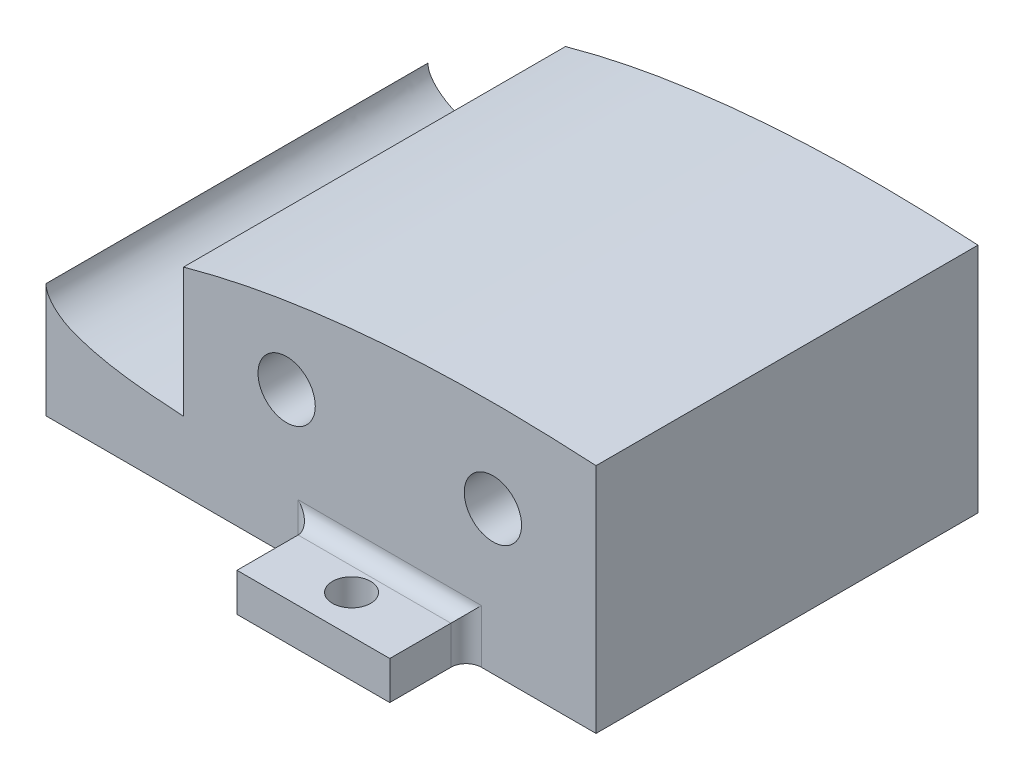
ISO-10303-21;
HEADER;
FILE_DESCRIPTION(('STEP AP214'),'2;1');
FILE_NAME('part.step','',(''),(''),'','','');
FILE_SCHEMA(('AUTOMOTIVE_DESIGN { 1 0 10303 214 1 1 1 1 }'));
ENDSEC;
DATA;
#1=APPLICATION_CONTEXT('core data for automotive mechanical design processes');
#2=APPLICATION_PROTOCOL_DEFINITION('international standard','automotive_design',2000,#1);
#3=PRODUCT_CONTEXT('',#1,'mechanical');
#4=PRODUCT('Part','Part','',(#3));
#5=PRODUCT_RELATED_PRODUCT_CATEGORY('part','',(#4));
#6=PRODUCT_DEFINITION_FORMATION('','',#4);
#7=PRODUCT_DEFINITION_CONTEXT('part definition',#1,'design');
#8=PRODUCT_DEFINITION('design','',#6,#7);
#9=PRODUCT_DEFINITION_SHAPE('','',#8);
#10=(LENGTH_UNIT() NAMED_UNIT(*) SI_UNIT(.MILLI.,.METRE.));
#11=(NAMED_UNIT(*) PLANE_ANGLE_UNIT() SI_UNIT($,.RADIAN.));
#12=(NAMED_UNIT(*) SI_UNIT($,.STERADIAN.) SOLID_ANGLE_UNIT());
#13=UNCERTAINTY_MEASURE_WITH_UNIT(LENGTH_MEASURE(1.E-05),#10,'distance_accuracy_value','');
#14=(GEOMETRIC_REPRESENTATION_CONTEXT(3) GLOBAL_UNCERTAINTY_ASSIGNED_CONTEXT((#13)) GLOBAL_UNIT_ASSIGNED_CONTEXT((#10,
#11,#12)) REPRESENTATION_CONTEXT('',''));
#15=CARTESIAN_POINT('',(0.,0.,0.));
#16=DIRECTION('',(0.,0.,1.));
#17=DIRECTION('',(1.,0.,0.));
#18=AXIS2_PLACEMENT_3D('',#15,#16,#17);
#19=CARTESIAN_POINT('',(10.2056970357556,-6.31582471231669,31.75));
#20=DIRECTION('',(0.,0.,-1.));
#21=DIRECTION('',(-1.,0.,0.));
#22=AXIS2_PLACEMENT_3D('',#19,#20,#21);
#23=PLANE('',#22);
#24=CARTESIAN_POINT('',(40.005,4.73459418824922,31.75));
#25=DIRECTION('',(0.,0.,1.));
#26=DIRECTION('',(1.,0.,0.));
#27=AXIS2_PLACEMENT_3D('',#24,#25,#26);
#28=CIRCLE('',#27,4.7625);
#29=CARTESIAN_POINT('',(44.7675,4.73459418824922,31.75));
#30=VERTEX_POINT('',#29);
#31=EDGE_CURVE('E234',#30,#30,#28,.T.);
#32=ORIENTED_EDGE('',*,*,#31,.F.);
#33=EDGE_LOOP('',(#32));
#34=FACE_BOUND('',#33,.T.);
#35=CARTESIAN_POINT('',(74.295,4.73459418824922,31.75));
#36=DIRECTION('',(0.,0.,1.));
#37=DIRECTION('',(1.,0.,0.));
#38=AXIS2_PLACEMENT_3D('',#35,#36,#37);
#39=CIRCLE('',#38,4.7625);
#40=CARTESIAN_POINT('',(79.0575,4.73459418824922,31.75));
#41=VERTEX_POINT('',#40);
#42=EDGE_CURVE('E239',#41,#41,#39,.T.);
#43=ORIENTED_EDGE('',*,*,#42,.F.);
#44=EDGE_LOOP('',(#43));
#45=FACE_BOUND('',#44,.T.);
#46=DIRECTION('',(1.,0.,0.));
#47=VECTOR('',#46,1.);
#48=CARTESIAN_POINT('',(10.2056970357556,-10.16,31.75));
#49=LINE('',#48,#47);
#50=CARTESIAN_POINT('',(41.91,-10.16,31.75));
#51=VERTEX_POINT('',#50);
#52=CARTESIAN_POINT('',(72.39,-10.16,31.75));
#53=VERTEX_POINT('',#52);
#54=EDGE_CURVE('E395',#51,#53,#49,.T.);
#55=ORIENTED_EDGE('',*,*,#54,.T.);
#56=DIRECTION('',(0.,-1.,0.));
#57=VECTOR('',#56,1.);
#58=CARTESIAN_POINT('',(72.39,-6.31582471231669,31.75));
#59=LINE('',#58,#57);
#60=CARTESIAN_POINT('',(72.39,-19.05,31.75));
#61=VERTEX_POINT('',#60);
#62=EDGE_CURVE('E397',#53,#61,#59,.T.);
#63=ORIENTED_EDGE('',*,*,#62,.T.);
#64=DIRECTION('',(1.,0.,0.));
#65=VECTOR('',#64,1.);
#66=CARTESIAN_POINT('',(0.,-19.05,31.75));
#67=LINE('',#66,#65);
#68=CARTESIAN_POINT('',(91.44,-19.05,31.75));
#69=VERTEX_POINT('',#68);
#70=EDGE_CURVE('E253',#61,#69,#67,.T.);
#71=ORIENTED_EDGE('',*,*,#70,.T.);
#72=DIRECTION('',(0.,1.,0.));
#73=VECTOR('',#72,1.);
#74=CARTESIAN_POINT('',(91.44,-19.05,31.75));
#75=LINE('',#74,#73);
#76=CARTESIAN_POINT('',(91.44,19.5088736891979,31.75));
#77=VERTEX_POINT('',#76);
#78=EDGE_CURVE('E257',#69,#77,#75,.T.);
#79=ORIENTED_EDGE('',*,*,#78,.T.);
#80=CARTESIAN_POINT('',(91.44,19.5088736891978,31.75));
#81=CARTESIAN_POINT('',(84.0356208057941,19.9340562675606,31.75));
#82=CARTESIAN_POINT('',(72.7920173753231,20.2231971549313,31.75));
#83=CARTESIAN_POINT('',(57.7264010197968,19.5765861767158,31.75));
#84=CARTESIAN_POINT('',(46.2411379939035,18.4871941623707,31.75));
#85=CARTESIAN_POINT('',(34.713862172181,16.7389871339913,31.75));
#86=CARTESIAN_POINT('',(26.9507844864313,14.9427772095461,31.75));
#87=CARTESIAN_POINT('',(23.0064368505171,13.8506529487284,31.75));
#88=CARTESIAN_POINT('',(22.86,13.8098436201286,31.75));
#89=B_SPLINE_CURVE_WITH_KNOTS('',3,(#80,#81,#82,#83,#84,#85,#86,#87,#88),.UNSPECIFIED.,.F.,.F.,
(4,1,1,1,1,1,4),(0.299041320860091,0.346600594361287,0.371102737044853,0.395726297170324,
0.420570145356384,0.445825119255769,0.446799337210652),.UNSPECIFIED.);
#90=CARTESIAN_POINT('',(22.86,13.8098436201286,31.75));
#91=VERTEX_POINT('',#90);
#92=EDGE_CURVE('E260',#77,#91,#89,.T.);
#93=ORIENTED_EDGE('',*,*,#92,.T.);
#94=DIRECTION('',(0.,-1.,0.));
#95=VECTOR('',#94,1.);
#96=CARTESIAN_POINT('',(22.86,-7.67430327285865,31.75));
#97=LINE('',#96,#95);
#98=CARTESIAN_POINT('',(22.86,-7.67430327285865,31.75));
#99=VERTEX_POINT('',#98);
#100=EDGE_CURVE('E265',#91,#99,#97,.T.);
#101=ORIENTED_EDGE('',*,*,#100,.T.);
#102=CARTESIAN_POINT('',(22.86,-7.67430327285865,31.75));
#103=CARTESIAN_POINT('',(22.8179718838394,-7.67196252222702,31.75));
#104=CARTESIAN_POINT('',(20.8708976464376,-7.56281406861255,31.75));
#105=CARTESIAN_POINT('',(17.0138961117884,-7.2812831021067,31.75));
#106=CARTESIAN_POINT('',(11.2894173856809,-6.62752917001449,31.75));
#107=CARTESIAN_POINT('',(6.45703018897089,-5.50998661950332,31.75));
#108=CARTESIAN_POINT('',(2.41602196168863,-3.93592215596752,31.75));
#109=CARTESIAN_POINT('',(0.134938935978925,-1.68844864889388,31.75));
#110=CARTESIAN_POINT('',(-2.62126690560269E-12,-0.178677160299536,31.75));
#111=CARTESIAN_POINT('',(0.,0.,31.75));
#112=B_SPLINE_CURVE_WITH_KNOTS('',3,(#102,#103,#104,#105,#106,#107,#108,#109,#110,#111),
.UNSPECIFIED.,.F.,.F.,(4,1,1,1,1,1,1,4),(0.505625692779016,0.505895616382474,0.518130853139829,
0.530412973038793,0.542915984505902,0.549534217048153,0.558818957921815,0.560056294318642),.UNSPECIFIED.);
#113=CARTESIAN_POINT('',(0.,0.,31.75));
#114=VERTEX_POINT('',#113);
#115=EDGE_CURVE('E242',#99,#114,#112,.T.);
#116=ORIENTED_EDGE('',*,*,#115,.T.);
#117=DIRECTION('',(0.,-1.,0.));
#118=VECTOR('',#117,1.);
#119=CARTESIAN_POINT('',(0.,0.,31.75));
#120=LINE('',#119,#118);
#121=CARTESIAN_POINT('',(0.,-19.05,31.75));
#122=VERTEX_POINT('',#121);
#123=EDGE_CURVE('E247',#114,#122,#120,.T.);
#124=ORIENTED_EDGE('',*,*,#123,.T.);
#125=CARTESIAN_POINT('',(41.91,-19.05,31.75));
#126=VERTEX_POINT('',#125);
#127=EDGE_CURVE('E254',#122,#126,#67,.T.);
#128=ORIENTED_EDGE('',*,*,#127,.T.);
#129=DIRECTION('',(0.,-1.,0.));
#130=VECTOR('',#129,1.);
#131=CARTESIAN_POINT('',(41.91,-6.31582471231669,31.75));
#132=LINE('',#131,#130);
#133=EDGE_CURVE('E393',#126,#51,#132,.F.);
#134=ORIENTED_EDGE('',*,*,#133,.T.);
#135=EDGE_LOOP('',(#55,#63,#71,#79,#93,#101,#116,#124,#128,#134));
#136=FACE_BOUND('',#135,.T.);
#137=ADVANCED_FACE('F39',(#34,#45,#136),#23,.F.);
#138=CARTESIAN_POINT('',(22.86,-7.67430327285865,-31.75));
#139=CARTESIAN_POINT('',(22.8179718838394,-7.67196252222702,-31.75));
#140=CARTESIAN_POINT('',(20.8708976464376,-7.56281406861255,-31.75));
#141=CARTESIAN_POINT('',(17.0138961117884,-7.2812831021067,-31.75));
#142=CARTESIAN_POINT('',(11.2894173856809,-6.62752917001449,-31.75));
#143=CARTESIAN_POINT('',(6.45703018897089,-5.50998661950332,-31.75));
#144=CARTESIAN_POINT('',(2.41602196168863,-3.93592215596752,-31.75));
#145=CARTESIAN_POINT('',(0.134938935978925,-1.68844864889388,-31.75));
#146=CARTESIAN_POINT('',(-2.62126690560269E-12,-0.178677160299536,-31.75));
#147=CARTESIAN_POINT('',(0.,0.,-31.75));
#148=B_SPLINE_CURVE_WITH_KNOTS('',3,(#138,#139,#140,#141,#142,#143,#144,#145,#146,#147),
.UNSPECIFIED.,.F.,.F.,(4,1,1,1,1,1,1,4),(0.505625692779016,0.505895616382474,0.518130853139829,
0.530412973038793,0.542915984505902,0.549534217048153,0.558818957921815,0.560056294318642),.UNSPECIFIED.);
#149=DIRECTION('',(0.,0.,1.));
#150=VECTOR('',#149,1.);
#151=SURFACE_OF_LINEAR_EXTRUSION('',#148,#150);
#152=DIRECTION('',(0.,0.,1.));
#153=VECTOR('',#152,1.);
#154=CARTESIAN_POINT('',(0.,0.,-31.75));
#155=LINE('',#154,#153);
#156=CARTESIAN_POINT('',(0.,0.,-31.75));
#157=VERTEX_POINT('',#156);
#158=EDGE_CURVE('E369',#157,#114,#155,.T.);
#159=ORIENTED_EDGE('',*,*,#158,.T.);
#160=ORIENTED_EDGE('',*,*,#115,.F.);
#161=DIRECTION('',(0.,0.,1.));
#162=VECTOR('',#161,1.);
#163=CARTESIAN_POINT('',(22.86,-7.67430327285865,-31.75));
#164=LINE('',#163,#162);
#165=CARTESIAN_POINT('',(22.86,-7.67430327285865,-31.75));
#166=VERTEX_POINT('',#165);
#167=EDGE_CURVE('E370',#166,#99,#164,.T.);
#168=ORIENTED_EDGE('',*,*,#167,.F.);
#169=EDGE_CURVE('E277',#166,#157,#148,.T.);
#170=ORIENTED_EDGE('',*,*,#169,.T.);
#171=EDGE_LOOP('',(#159,#160,#168,#170));
#172=FACE_BOUND('',#171,.T.);
#173=ADVANCED_FACE('F289',(#172),#151,.T.);
#174=CARTESIAN_POINT('',(22.86,-7.67430327285865,-31.75));
#175=DIRECTION('',(-1.,0.,0.));
#176=DIRECTION('',(0.,-1.,0.));
#177=AXIS2_PLACEMENT_3D('',#174,#175,#176);
#178=PLANE('',#177);
#179=ORIENTED_EDGE('',*,*,#167,.T.);
#180=ORIENTED_EDGE('',*,*,#100,.F.);
#181=DIRECTION('',(0.,0.,1.));
#182=VECTOR('',#181,1.);
#183=CARTESIAN_POINT('',(22.86,13.8098436201286,-31.75));
#184=LINE('',#183,#182);
#185=CARTESIAN_POINT('',(22.86,13.8098436201286,-31.75));
#186=VERTEX_POINT('',#185);
#187=EDGE_CURVE('E373',#186,#91,#184,.T.);
#188=ORIENTED_EDGE('',*,*,#187,.F.);
#189=DIRECTION('',(0.,-1.,0.));
#190=VECTOR('',#189,1.);
#191=CARTESIAN_POINT('',(22.86,-7.67430327285865,-31.75));
#192=LINE('',#191,#190);
#193=EDGE_CURVE('E362',#186,#166,#192,.T.);
#194=ORIENTED_EDGE('',*,*,#193,.T.);
#195=EDGE_LOOP('',(#179,#180,#188,#194));
#196=FACE_BOUND('',#195,.T.);
#197=ADVANCED_FACE('F293',(#196),#178,.T.);
#198=CARTESIAN_POINT('',(91.44,19.5088736891978,-31.75));
#199=CARTESIAN_POINT('',(84.0356208057941,19.9340562675606,-31.75));
#200=CARTESIAN_POINT('',(72.7920173753231,20.2231971549313,-31.75));
#201=CARTESIAN_POINT('',(57.7264010197968,19.5765861767158,-31.75));
#202=CARTESIAN_POINT('',(46.2411379939035,18.4871941623707,-31.75));
#203=CARTESIAN_POINT('',(34.713862172181,16.7389871339913,-31.75));
#204=CARTESIAN_POINT('',(26.9507844864313,14.9427772095461,-31.75));
#205=CARTESIAN_POINT('',(23.0064368505171,13.8506529487284,-31.75));
#206=CARTESIAN_POINT('',(22.86,13.8098436201286,-31.75));
#207=B_SPLINE_CURVE_WITH_KNOTS('',3,(#198,#199,#200,#201,#202,#203,#204,#205,#206),
.UNSPECIFIED.,.F.,.F.,(4,1,1,1,1,1,4),(0.299041320860091,0.346600594361287,0.371102737044853,
0.395726297170324,0.420570145356384,0.445825119255769,0.446799337210652),.UNSPECIFIED.);
#208=DIRECTION('',(0.,0.,1.));
#209=VECTOR('',#208,1.);
#210=SURFACE_OF_LINEAR_EXTRUSION('',#207,#209);
#211=ORIENTED_EDGE('',*,*,#187,.T.);
#212=ORIENTED_EDGE('',*,*,#92,.F.);
#213=DIRECTION('',(0.,0.,1.));
#214=VECTOR('',#213,1.);
#215=CARTESIAN_POINT('',(91.44,19.5088736891979,-31.75));
#216=LINE('',#215,#214);
#217=CARTESIAN_POINT('',(91.44,19.5088736891979,-31.75));
#218=VERTEX_POINT('',#217);
#219=EDGE_CURVE('E375',#218,#77,#216,.T.);
#220=ORIENTED_EDGE('',*,*,#219,.F.);
#221=EDGE_CURVE('E355',#218,#186,#207,.T.);
#222=ORIENTED_EDGE('',*,*,#221,.T.);
#223=EDGE_LOOP('',(#211,#212,#220,#222));
#224=FACE_BOUND('',#223,.T.);
#225=ADVANCED_FACE('F348',(#224),#210,.T.);
#226=CARTESIAN_POINT('',(91.44,-19.05,-31.75));
#227=DIRECTION('',(1.,0.,0.));
#228=DIRECTION('',(0.,1.,0.));
#229=AXIS2_PLACEMENT_3D('',#226,#227,#228);
#230=PLANE('',#229);
#231=ORIENTED_EDGE('',*,*,#219,.T.);
#232=ORIENTED_EDGE('',*,*,#78,.F.);
#233=DIRECTION('',(0.,0.,1.));
#234=VECTOR('',#233,1.);
#235=CARTESIAN_POINT('',(91.44,-19.05,-31.75));
#236=LINE('',#235,#234);
#237=CARTESIAN_POINT('',(91.44,-19.05,-31.75));
#238=VERTEX_POINT('',#237);
#239=EDGE_CURVE('E377',#238,#69,#236,.T.);
#240=ORIENTED_EDGE('',*,*,#239,.F.);
#241=DIRECTION('',(0.,1.,0.));
#242=VECTOR('',#241,1.);
#243=CARTESIAN_POINT('',(91.44,-19.05,-31.75));
#244=LINE('',#243,#242);
#245=EDGE_CURVE('E363',#238,#218,#244,.T.);
#246=ORIENTED_EDGE('',*,*,#245,.T.);
#247=EDGE_LOOP('',(#231,#232,#240,#246));
#248=FACE_BOUND('',#247,.T.);
#249=ADVANCED_FACE('F353',(#248),#230,.T.);
#250=CARTESIAN_POINT('',(0.,-19.05,-31.75));
#251=DIRECTION('',(0.,-1.,0.));
#252=DIRECTION('',(0.,0.,-1.));
#253=AXIS2_PLACEMENT_3D('',#250,#251,#252);
#254=PLANE('',#253);
#255=ORIENTED_EDGE('',*,*,#239,.T.);
#256=ORIENTED_EDGE('',*,*,#70,.F.);
#257=CARTESIAN_POINT('',(72.39,-19.05,34.29));
#258=DIRECTION('',(0.,-1.,0.));
#259=DIRECTION('',(0.,0.,-1.));
#260=AXIS2_PLACEMENT_3D('',#257,#258,#259);
#261=CIRCLE('',#260,2.54);
#262=CARTESIAN_POINT('',(69.85,-19.05,34.29));
#263=VERTEX_POINT('',#262);
#264=EDGE_CURVE('E48',#61,#263,#261,.F.);
#265=ORIENTED_EDGE('',*,*,#264,.T.);
#266=DIRECTION('',(0.,0.,1.));
#267=VECTOR('',#266,1.);
#268=CARTESIAN_POINT('',(69.85,-19.05,31.75));
#269=LINE('',#268,#267);
#270=CARTESIAN_POINT('',(69.85,-19.05,44.45));
#271=VERTEX_POINT('',#270);
#272=EDGE_CURVE('E228',#263,#271,#269,.T.);
#273=ORIENTED_EDGE('',*,*,#272,.T.);
#274=DIRECTION('',(-1.,0.,0.));
#275=VECTOR('',#274,1.);
#276=CARTESIAN_POINT('',(44.45,-19.05,44.45));
#277=LINE('',#276,#275);
#278=CARTESIAN_POINT('',(44.45,-19.05,44.45));
#279=VERTEX_POINT('',#278);
#280=EDGE_CURVE('E221',#271,#279,#277,.T.);
#281=ORIENTED_EDGE('',*,*,#280,.T.);
#282=DIRECTION('',(0.,0.,-1.));
#283=VECTOR('',#282,1.);
#284=CARTESIAN_POINT('',(44.45,-19.05,31.75));
#285=LINE('',#284,#283);
#286=CARTESIAN_POINT('',(44.45,-19.05,34.29));
#287=VERTEX_POINT('',#286);
#288=EDGE_CURVE('E215',#279,#287,#285,.T.);
#289=ORIENTED_EDGE('',*,*,#288,.T.);
#290=CARTESIAN_POINT('',(41.91,-19.05,34.29));
#291=DIRECTION('',(0.,-1.,0.));
#292=DIRECTION('',(0.,0.,-1.));
#293=AXIS2_PLACEMENT_3D('',#290,#291,#292);
#294=CIRCLE('',#293,2.54);
#295=EDGE_CURVE('E11',#287,#126,#294,.F.);
#296=ORIENTED_EDGE('',*,*,#295,.T.);
#297=ORIENTED_EDGE('',*,*,#127,.F.);
#298=DIRECTION('',(0.,0.,1.));
#299=VECTOR('',#298,1.);
#300=CARTESIAN_POINT('',(0.,-19.05,-31.75));
#301=LINE('',#300,#299);
#302=CARTESIAN_POINT('',(0.,-19.05,-31.75));
#303=VERTEX_POINT('',#302);
#304=EDGE_CURVE('E379',#303,#122,#301,.T.);
#305=ORIENTED_EDGE('',*,*,#304,.F.);
#306=DIRECTION('',(1.,0.,0.));
#307=VECTOR('',#306,1.);
#308=CARTESIAN_POINT('',(0.,-19.05,-31.75));
#309=LINE('',#308,#307);
#310=CARTESIAN_POINT('',(41.91,-19.05,-31.75));
#311=VERTEX_POINT('',#310);
#312=EDGE_CURVE('E431',#303,#311,#309,.T.);
#313=ORIENTED_EDGE('',*,*,#312,.T.);
#314=CARTESIAN_POINT('',(41.91,-19.05,-34.29));
#315=DIRECTION('',(0.,-1.,0.));
#316=DIRECTION('',(0.,0.,-1.));
#317=AXIS2_PLACEMENT_3D('',#314,#315,#316);
#318=CIRCLE('',#317,2.54);
#319=CARTESIAN_POINT('',(44.45,-19.05,-34.29));
#320=VERTEX_POINT('',#319);
#321=EDGE_CURVE('E404',#311,#320,#318,.F.);
#322=ORIENTED_EDGE('',*,*,#321,.T.);
#323=DIRECTION('',(0.,0.,-1.));
#324=VECTOR('',#323,1.);
#325=CARTESIAN_POINT('',(44.45,-19.05,-31.75));
#326=LINE('',#325,#324);
#327=CARTESIAN_POINT('',(44.45,-19.05,-44.45));
#328=VERTEX_POINT('',#327);
#329=EDGE_CURVE('E190',#320,#328,#326,.T.);
#330=ORIENTED_EDGE('',*,*,#329,.T.);
#331=DIRECTION('',(1.,0.,0.));
#332=VECTOR('',#331,1.);
#333=CARTESIAN_POINT('',(44.45,-19.05,-44.45));
#334=LINE('',#333,#332);
#335=CARTESIAN_POINT('',(69.85,-19.05,-44.45));
#336=VERTEX_POINT('',#335);
#337=EDGE_CURVE('E172',#328,#336,#334,.T.);
#338=ORIENTED_EDGE('',*,*,#337,.T.);
#339=DIRECTION('',(0.,0.,1.));
#340=VECTOR('',#339,1.);
#341=CARTESIAN_POINT('',(69.85,-19.05,-31.75));
#342=LINE('',#341,#340);
#343=CARTESIAN_POINT('',(69.85,-19.05,-34.29));
#344=VERTEX_POINT('',#343);
#345=EDGE_CURVE('E187',#336,#344,#342,.T.);
#346=ORIENTED_EDGE('',*,*,#345,.T.);
#347=CARTESIAN_POINT('',(72.39,-19.05,-34.29));
#348=DIRECTION('',(0.,-1.,0.));
#349=DIRECTION('',(0.,0.,-1.));
#350=AXIS2_PLACEMENT_3D('',#347,#348,#349);
#351=CIRCLE('',#350,2.54);
#352=CARTESIAN_POINT('',(72.39,-19.05,-31.75));
#353=VERTEX_POINT('',#352);
#354=EDGE_CURVE('E406',#344,#353,#351,.F.);
#355=ORIENTED_EDGE('',*,*,#354,.T.);
#356=EDGE_CURVE('E435',#353,#238,#309,.T.);
#357=ORIENTED_EDGE('',*,*,#356,.T.);
#358=EDGE_LOOP('',(#255,#256,#265,#273,#281,#289,#296,#297,#305,#313,#322,#330,#338,#346,#355,#357));
#359=FACE_BOUND('',#358,.T.);
#360=CARTESIAN_POINT('',(57.15,-19.05,38.1));
#361=DIRECTION('',(0.,-1.,0.));
#362=DIRECTION('',(0.,0.,-1.));
#363=AXIS2_PLACEMENT_3D('',#360,#361,#362);
#364=CIRCLE('',#363,3.175);
#365=CARTESIAN_POINT('',(57.15,-19.05,34.925));
#366=VERTEX_POINT('',#365);
#367=EDGE_CURVE('E209',#366,#366,#364,.T.);
#368=ORIENTED_EDGE('',*,*,#367,.F.);
#369=EDGE_LOOP('',(#368));
#370=FACE_BOUND('',#369,.T.);
#371=CARTESIAN_POINT('',(57.15,-19.05,-38.1));
#372=DIRECTION('',(0.,-1.,0.));
#373=DIRECTION('',(0.,0.,1.));
#374=AXIS2_PLACEMENT_3D('',#371,#372,#373);
#375=CIRCLE('',#374,3.175);
#376=CARTESIAN_POINT('',(57.15,-19.05,-34.925));
#377=VERTEX_POINT('',#376);
#378=EDGE_CURVE('E206',#377,#377,#375,.T.);
#379=ORIENTED_EDGE('',*,*,#378,.F.);
#380=EDGE_LOOP('',(#379));
#381=FACE_BOUND('',#380,.T.);
#382=ADVANCED_FACE('F185',(#359,#370,#381),#254,.T.);
#383=CARTESIAN_POINT('',(0.,0.,-31.75));
#384=DIRECTION('',(-1.,0.,0.));
#385=DIRECTION('',(0.,-1.,0.));
#386=AXIS2_PLACEMENT_3D('',#383,#384,#385);
#387=PLANE('',#386);
#388=ORIENTED_EDGE('',*,*,#304,.T.);
#389=ORIENTED_EDGE('',*,*,#123,.F.);
#390=ORIENTED_EDGE('',*,*,#158,.F.);
#391=DIRECTION('',(0.,-1.,0.));
#392=VECTOR('',#391,1.);
#393=CARTESIAN_POINT('',(0.,0.,-31.75));
#394=LINE('',#393,#392);
#395=EDGE_CURVE('E283',#157,#303,#394,.T.);
#396=ORIENTED_EDGE('',*,*,#395,.T.);
#397=EDGE_LOOP('',(#388,#389,#390,#396));
#398=FACE_BOUND('',#397,.T.);
#399=ADVANCED_FACE('F295',(#398),#387,.T.);
#400=CARTESIAN_POINT('',(10.2056970357556,-6.31582471231669,-31.75));
#401=DIRECTION('',(0.,0.,-1.));
#402=DIRECTION('',(-1.,0.,0.));
#403=AXIS2_PLACEMENT_3D('',#400,#401,#402);
#404=PLANE('',#403);
#405=DIRECTION('',(-1.,0.,0.));
#406=VECTOR('',#405,1.);
#407=CARTESIAN_POINT('',(44.45,-10.16,-31.75));
#408=LINE('',#407,#406);
#409=CARTESIAN_POINT('',(72.39,-10.16,-31.75));
#410=VERTEX_POINT('',#409);
#411=CARTESIAN_POINT('',(41.91,-10.16,-31.75));
#412=VERTEX_POINT('',#411);
#413=EDGE_CURVE('E383',#410,#412,#408,.T.);
#414=ORIENTED_EDGE('',*,*,#413,.T.);
#415=DIRECTION('',(0.,-1.,0.));
#416=VECTOR('',#415,1.);
#417=CARTESIAN_POINT('',(41.91,-19.05,-31.75));
#418=LINE('',#417,#416);
#419=EDGE_CURVE('E385',#412,#311,#418,.T.);
#420=ORIENTED_EDGE('',*,*,#419,.T.);
#421=ORIENTED_EDGE('',*,*,#312,.F.);
#422=ORIENTED_EDGE('',*,*,#395,.F.);
#423=ORIENTED_EDGE('',*,*,#169,.F.);
#424=ORIENTED_EDGE('',*,*,#193,.F.);
#425=ORIENTED_EDGE('',*,*,#221,.F.);
#426=ORIENTED_EDGE('',*,*,#245,.F.);
#427=ORIENTED_EDGE('',*,*,#356,.F.);
#428=DIRECTION('',(0.,-1.,0.));
#429=VECTOR('',#428,1.);
#430=CARTESIAN_POINT('',(72.39,-12.7,-31.75));
#431=LINE('',#430,#429);
#432=EDGE_CURVE('E372',#353,#410,#431,.F.);
#433=ORIENTED_EDGE('',*,*,#432,.T.);
#434=EDGE_LOOP('',(#414,#420,#421,#422,#423,#424,#425,#426,#427,#433));
#435=FACE_BOUND('',#434,.T.);
#436=CARTESIAN_POINT('',(40.005,4.73459418824922,-31.75));
#437=DIRECTION('',(0.,0.,1.));
#438=DIRECTION('',(1.,0.,0.));
#439=AXIS2_PLACEMENT_3D('',#436,#437,#438);
#440=CIRCLE('',#439,4.7625);
#441=CARTESIAN_POINT('',(44.7675,4.73459418824922,-31.75));
#442=VERTEX_POINT('',#441);
#443=EDGE_CURVE('E271',#442,#442,#440,.T.);
#444=ORIENTED_EDGE('',*,*,#443,.T.);
#445=EDGE_LOOP('',(#444));
#446=FACE_BOUND('',#445,.T.);
#447=CARTESIAN_POINT('',(74.295,4.73459418824922,-31.75));
#448=DIRECTION('',(0.,0.,1.));
#449=DIRECTION('',(1.,0.,0.));
#450=AXIS2_PLACEMENT_3D('',#447,#448,#449);
#451=CIRCLE('',#450,4.7625);
#452=CARTESIAN_POINT('',(79.0575,4.73459418824922,-31.75));
#453=VERTEX_POINT('',#452);
#454=EDGE_CURVE('E274',#453,#453,#451,.T.);
#455=ORIENTED_EDGE('',*,*,#454,.T.);
#456=EDGE_LOOP('',(#455));
#457=FACE_BOUND('',#456,.T.);
#458=ADVANCED_FACE('F341',(#435,#446,#457),#404,.T.);
#459=CARTESIAN_POINT('',(74.295,4.73459418824922,-31.75));
#460=DIRECTION('',(0.,0.,1.));
#461=DIRECTION('',(1.,0.,0.));
#462=AXIS2_PLACEMENT_3D('',#459,#460,#461);
#463=CYLINDRICAL_SURFACE('',#462,4.7625);
#464=ORIENTED_EDGE('',*,*,#454,.F.);
#465=EDGE_LOOP('',(#464));
#466=FACE_BOUND('',#465,.T.);
#467=ORIENTED_EDGE('',*,*,#42,.T.);
#468=EDGE_LOOP('',(#467));
#469=FACE_BOUND('',#468,.T.);
#470=ADVANCED_FACE('F337',(#466,#469),#463,.F.);
#471=CARTESIAN_POINT('',(40.005,4.73459418824922,-31.75));
#472=DIRECTION('',(0.,0.,1.));
#473=DIRECTION('',(1.,0.,0.));
#474=AXIS2_PLACEMENT_3D('',#471,#472,#473);
#475=CYLINDRICAL_SURFACE('',#474,4.7625);
#476=ORIENTED_EDGE('',*,*,#443,.F.);
#477=EDGE_LOOP('',(#476));
#478=FACE_BOUND('',#477,.T.);
#479=ORIENTED_EDGE('',*,*,#31,.T.);
#480=EDGE_LOOP('',(#479));
#481=FACE_BOUND('',#480,.T.);
#482=ADVANCED_FACE('F334',(#478,#481),#475,.F.);
#483=CARTESIAN_POINT('',(44.45,-12.7,31.75));
#484=DIRECTION('',(-1.,0.,0.));
#485=DIRECTION('',(0.,0.,1.));
#486=AXIS2_PLACEMENT_3D('',#483,#484,#485);
#487=PLANE('',#486);
#488=DIRECTION('',(0.,0.,-1.));
#489=VECTOR('',#488,1.);
#490=CARTESIAN_POINT('',(44.45,-12.7,31.75));
#491=LINE('',#490,#489);
#492=CARTESIAN_POINT('',(44.45,-12.7,44.45));
#493=VERTEX_POINT('',#492);
#494=CARTESIAN_POINT('',(44.45,-12.7,34.29));
#495=VERTEX_POINT('',#494);
#496=EDGE_CURVE('E218',#493,#495,#491,.T.);
#497=ORIENTED_EDGE('',*,*,#496,.T.);
#498=DIRECTION('',(0.,-1.,0.));
#499=VECTOR('',#498,1.);
#500=CARTESIAN_POINT('',(44.45,-12.7,34.29));
#501=LINE('',#500,#499);
#502=EDGE_CURVE('E56',#495,#287,#501,.T.);
#503=ORIENTED_EDGE('',*,*,#502,.T.);
#504=ORIENTED_EDGE('',*,*,#288,.F.);
#505=DIRECTION('',(0.,-1.,0.));
#506=VECTOR('',#505,1.);
#507=CARTESIAN_POINT('',(44.45,-12.7,44.45));
#508=LINE('',#507,#506);
#509=EDGE_CURVE('E232',#493,#279,#508,.T.);
#510=ORIENTED_EDGE('',*,*,#509,.F.);
#511=EDGE_LOOP('',(#497,#503,#504,#510));
#512=FACE_BOUND('',#511,.T.);
#513=ADVANCED_FACE('F332',(#512),#487,.T.);
#514=CARTESIAN_POINT('',(44.45,-12.7,44.45));
#515=DIRECTION('',(0.,0.,1.));
#516=DIRECTION('',(1.,0.,0.));
#517=AXIS2_PLACEMENT_3D('',#514,#515,#516);
#518=PLANE('',#517);
#519=ORIENTED_EDGE('',*,*,#280,.F.);
#520=DIRECTION('',(0.,-1.,0.));
#521=VECTOR('',#520,1.);
#522=CARTESIAN_POINT('',(69.85,-12.7,44.45));
#523=LINE('',#522,#521);
#524=CARTESIAN_POINT('',(69.85,-12.7,44.45));
#525=VERTEX_POINT('',#524);
#526=EDGE_CURVE('E226',#525,#271,#523,.T.);
#527=ORIENTED_EDGE('',*,*,#526,.F.);
#528=DIRECTION('',(-1.,0.,0.));
#529=VECTOR('',#528,1.);
#530=CARTESIAN_POINT('',(44.45,-12.7,44.45));
#531=LINE('',#530,#529);
#532=EDGE_CURVE('E223',#525,#493,#531,.T.);
#533=ORIENTED_EDGE('',*,*,#532,.T.);
#534=ORIENTED_EDGE('',*,*,#509,.T.);
#535=EDGE_LOOP('',(#519,#527,#533,#534));
#536=FACE_BOUND('',#535,.T.);
#537=ADVANCED_FACE('F455',(#536),#518,.T.);
#538=CARTESIAN_POINT('',(69.85,-12.7,31.75));
#539=DIRECTION('',(1.,0.,0.));
#540=DIRECTION('',(0.,0.,-1.));
#541=AXIS2_PLACEMENT_3D('',#538,#539,#540);
#542=PLANE('',#541);
#543=ORIENTED_EDGE('',*,*,#272,.F.);
#544=DIRECTION('',(0.,-1.,0.));
#545=VECTOR('',#544,1.);
#546=CARTESIAN_POINT('',(69.85,-12.7,34.29));
#547=LINE('',#546,#545);
#548=CARTESIAN_POINT('',(69.85,-12.7,34.29));
#549=VERTEX_POINT('',#548);
#550=EDGE_CURVE('E400',#263,#549,#547,.F.);
#551=ORIENTED_EDGE('',*,*,#550,.T.);
#552=DIRECTION('',(0.,0.,1.));
#553=VECTOR('',#552,1.);
#554=CARTESIAN_POINT('',(69.85,-12.7,31.75));
#555=LINE('',#554,#553);
#556=EDGE_CURVE('E220',#549,#525,#555,.T.);
#557=ORIENTED_EDGE('',*,*,#556,.T.);
#558=ORIENTED_EDGE('',*,*,#526,.T.);
#559=EDGE_LOOP('',(#543,#551,#557,#558));
#560=FACE_BOUND('',#559,.T.);
#561=ADVANCED_FACE('F450',(#560),#542,.T.);
#562=CARTESIAN_POINT('',(0.,-12.7,0.));
#563=DIRECTION('',(0.,1.,0.));
#564=DIRECTION('',(0.,0.,1.));
#565=AXIS2_PLACEMENT_3D('',#562,#563,#564);
#566=PLANE('',#565);
#567=CARTESIAN_POINT('',(57.15,-12.7,38.1));
#568=DIRECTION('',(0.,-1.,0.));
#569=DIRECTION('',(0.,0.,-1.));
#570=AXIS2_PLACEMENT_3D('',#567,#568,#569);
#571=CIRCLE('',#570,3.175);
#572=CARTESIAN_POINT('',(57.15,-12.7,34.925));
#573=VERTEX_POINT('',#572);
#574=EDGE_CURVE('E212',#573,#573,#571,.T.);
#575=ORIENTED_EDGE('',*,*,#574,.T.);
#576=EDGE_LOOP('',(#575));
#577=FACE_BOUND('',#576,.T.);
#578=ORIENTED_EDGE('',*,*,#556,.F.);
#579=DIRECTION('',(1.,0.,0.));
#580=VECTOR('',#579,1.);
#581=CARTESIAN_POINT('',(0.,-12.7,34.29));
#582=LINE('',#581,#580);
#583=EDGE_CURVE('E64',#549,#495,#582,.F.);
#584=ORIENTED_EDGE('',*,*,#583,.T.);
#585=ORIENTED_EDGE('',*,*,#496,.F.);
#586=ORIENTED_EDGE('',*,*,#532,.F.);
#587=EDGE_LOOP('',(#578,#584,#585,#586));
#588=FACE_BOUND('',#587,.T.);
#589=ADVANCED_FACE('F465',(#577,#588),#566,.T.);
#590=CARTESIAN_POINT('',(57.15,-12.7,38.1));
#591=DIRECTION('',(0.,-1.,0.));
#592=DIRECTION('',(0.,0.,-1.));
#593=AXIS2_PLACEMENT_3D('',#590,#591,#592);
#594=CYLINDRICAL_SURFACE('',#593,3.175);
#595=ORIENTED_EDGE('',*,*,#574,.F.);
#596=EDGE_LOOP('',(#595));
#597=FACE_BOUND('',#596,.T.);
#598=ORIENTED_EDGE('',*,*,#367,.T.);
#599=EDGE_LOOP('',(#598));
#600=FACE_BOUND('',#599,.T.);
#601=ADVANCED_FACE('F469',(#597,#600),#594,.F.);
#602=CARTESIAN_POINT('',(69.85,-12.7,-31.75));
#603=DIRECTION('',(1.,0.,0.));
#604=DIRECTION('',(0.,0.,-1.));
#605=AXIS2_PLACEMENT_3D('',#602,#603,#604);
#606=PLANE('',#605);
#607=DIRECTION('',(0.,0.,1.));
#608=VECTOR('',#607,1.);
#609=CARTESIAN_POINT('',(69.85,-12.7,-31.75));
#610=LINE('',#609,#608);
#611=CARTESIAN_POINT('',(69.85,-12.7,-44.45));
#612=VERTEX_POINT('',#611);
#613=CARTESIAN_POINT('',(69.85,-12.7,-34.29));
#614=VERTEX_POINT('',#613);
#615=EDGE_CURVE('E203',#612,#614,#610,.T.);
#616=ORIENTED_EDGE('',*,*,#615,.T.);
#617=DIRECTION('',(0.,-1.,0.));
#618=VECTOR('',#617,1.);
#619=CARTESIAN_POINT('',(69.85,-19.05,-34.29));
#620=LINE('',#619,#618);
#621=EDGE_CURVE('E195',#614,#344,#620,.T.);
#622=ORIENTED_EDGE('',*,*,#621,.T.);
#623=ORIENTED_EDGE('',*,*,#345,.F.);
#624=DIRECTION('',(0.,-1.,0.));
#625=VECTOR('',#624,1.);
#626=CARTESIAN_POINT('',(69.85,-12.7,-44.45));
#627=LINE('',#626,#625);
#628=EDGE_CURVE('E168',#612,#336,#627,.T.);
#629=ORIENTED_EDGE('',*,*,#628,.F.);
#630=EDGE_LOOP('',(#616,#622,#623,#629));
#631=FACE_BOUND('',#630,.T.);
#632=ADVANCED_FACE('F193',(#631),#606,.T.);
#633=CARTESIAN_POINT('',(44.45,-12.7,-44.45));
#634=DIRECTION('',(0.,0.,-1.));
#635=DIRECTION('',(-1.,0.,0.));
#636=AXIS2_PLACEMENT_3D('',#633,#634,#635);
#637=PLANE('',#636);
#638=ORIENTED_EDGE('',*,*,#337,.F.);
#639=DIRECTION('',(0.,-1.,0.));
#640=VECTOR('',#639,1.);
#641=CARTESIAN_POINT('',(44.45,-12.7,-44.45));
#642=LINE('',#641,#640);
#643=CARTESIAN_POINT('',(44.45,-12.7,-44.45));
#644=VERTEX_POINT('',#643);
#645=EDGE_CURVE('E179',#644,#328,#642,.T.);
#646=ORIENTED_EDGE('',*,*,#645,.F.);
#647=DIRECTION('',(1.,0.,0.));
#648=VECTOR('',#647,1.);
#649=CARTESIAN_POINT('',(44.45,-12.7,-44.45));
#650=LINE('',#649,#648);
#651=EDGE_CURVE('E174',#644,#612,#650,.T.);
#652=ORIENTED_EDGE('',*,*,#651,.T.);
#653=ORIENTED_EDGE('',*,*,#628,.T.);
#654=EDGE_LOOP('',(#638,#646,#652,#653));
#655=FACE_BOUND('',#654,.T.);
#656=ADVANCED_FACE('F170',(#655),#637,.T.);
#657=CARTESIAN_POINT('',(44.45,-12.7,-31.75));
#658=DIRECTION('',(-1.,0.,0.));
#659=DIRECTION('',(0.,0.,1.));
#660=AXIS2_PLACEMENT_3D('',#657,#658,#659);
#661=PLANE('',#660);
#662=ORIENTED_EDGE('',*,*,#329,.F.);
#663=DIRECTION('',(0.,-1.,0.));
#664=VECTOR('',#663,1.);
#665=CARTESIAN_POINT('',(44.45,-12.7,-34.29));
#666=LINE('',#665,#664);
#667=CARTESIAN_POINT('',(44.45,-12.7,-34.29));
#668=VERTEX_POINT('',#667);
#669=EDGE_CURVE('E388',#320,#668,#666,.F.);
#670=ORIENTED_EDGE('',*,*,#669,.T.);
#671=DIRECTION('',(0.,0.,-1.));
#672=VECTOR('',#671,1.);
#673=CARTESIAN_POINT('',(44.45,-12.7,-31.75));
#674=LINE('',#673,#672);
#675=EDGE_CURVE('E196',#668,#644,#674,.T.);
#676=ORIENTED_EDGE('',*,*,#675,.T.);
#677=ORIENTED_EDGE('',*,*,#645,.T.);
#678=EDGE_LOOP('',(#662,#670,#676,#677));
#679=FACE_BOUND('',#678,.T.);
#680=ADVANCED_FACE('F478',(#679),#661,.T.);
#681=CARTESIAN_POINT('',(0.,-12.7,0.));
#682=DIRECTION('',(0.,1.,0.));
#683=DIRECTION('',(0.,0.,1.));
#684=AXIS2_PLACEMENT_3D('',#681,#682,#683);
#685=PLANE('',#684);
#686=CARTESIAN_POINT('',(57.15,-12.7,-38.1));
#687=DIRECTION('',(0.,-1.,0.));
#688=DIRECTION('',(0.,0.,1.));
#689=AXIS2_PLACEMENT_3D('',#686,#687,#688);
#690=CIRCLE('',#689,3.175);
#691=CARTESIAN_POINT('',(57.15,-12.7,-34.925));
#692=VERTEX_POINT('',#691);
#693=EDGE_CURVE('E202',#692,#692,#690,.T.);
#694=ORIENTED_EDGE('',*,*,#693,.T.);
#695=EDGE_LOOP('',(#694));
#696=FACE_BOUND('',#695,.T.);
#697=ORIENTED_EDGE('',*,*,#675,.F.);
#698=DIRECTION('',(-1.,0.,0.));
#699=VECTOR('',#698,1.);
#700=CARTESIAN_POINT('',(69.85,-12.7,-34.29));
#701=LINE('',#700,#699);
#702=EDGE_CURVE('E390',#668,#614,#701,.F.);
#703=ORIENTED_EDGE('',*,*,#702,.T.);
#704=ORIENTED_EDGE('',*,*,#615,.F.);
#705=ORIENTED_EDGE('',*,*,#651,.F.);
#706=EDGE_LOOP('',(#697,#703,#704,#705));
#707=FACE_BOUND('',#706,.T.);
#708=ADVANCED_FACE('F474',(#696,#707),#685,.T.);
#709=CARTESIAN_POINT('',(57.15,-12.7,-38.1));
#710=DIRECTION('',(0.,-1.,0.));
#711=DIRECTION('',(0.,0.,-1.));
#712=AXIS2_PLACEMENT_3D('',#709,#710,#711);
#713=CYLINDRICAL_SURFACE('',#712,3.175);
#714=ORIENTED_EDGE('',*,*,#693,.F.);
#715=EDGE_LOOP('',(#714));
#716=FACE_BOUND('',#715,.T.);
#717=ORIENTED_EDGE('',*,*,#378,.T.);
#718=EDGE_LOOP('',(#717));
#719=FACE_BOUND('',#718,.T.);
#720=ADVANCED_FACE('F308',(#716,#719),#713,.F.);
#721=CARTESIAN_POINT('',(72.39,-12.7,-34.29));
#722=DIRECTION('',(0.,1.,0.));
#723=DIRECTION('',(0.,0.,1.));
#724=AXIS2_PLACEMENT_3D('',#721,#722,#723);
#725=CYLINDRICAL_SURFACE('',#724,2.54);
#726=ORIENTED_EDGE('',*,*,#354,.F.);
#727=ORIENTED_EDGE('',*,*,#621,.F.);
#728=CARTESIAN_POINT('',(72.39,-10.16,-34.29));
#729=DIRECTION('',(-0.707106781186547,0.707106781186547,0.));
#730=DIRECTION('',(0.707106781186547,0.707106781186547,0.));
#731=AXIS2_PLACEMENT_3D('',#728,#729,#730);
#732=ELLIPSE('',#731,3.59210244842766,2.54);
#733=EDGE_CURVE('E180',#410,#614,#732,.F.);
#734=ORIENTED_EDGE('',*,*,#733,.F.);
#735=ORIENTED_EDGE('',*,*,#432,.F.);
#736=EDGE_LOOP('',(#726,#727,#734,#735));
#737=FACE_BOUND('',#736,.T.);
#738=ADVANCED_FACE('F304',(#737),#725,.F.);
#739=CARTESIAN_POINT('',(10.2056970357556,-10.16,-34.29));
#740=DIRECTION('',(1.,0.,0.));
#741=DIRECTION('',(0.,0.,-1.));
#742=AXIS2_PLACEMENT_3D('',#739,#740,#741);
#743=CYLINDRICAL_SURFACE('',#742,2.54);
#744=ORIENTED_EDGE('',*,*,#733,.T.);
#745=ORIENTED_EDGE('',*,*,#702,.F.);
#746=CARTESIAN_POINT('',(41.91,-10.16,-34.29));
#747=DIRECTION('',(0.707106781186547,0.707106781186547,0.));
#748=DIRECTION('',(0.707106781186547,-0.707106781186547,0.));
#749=AXIS2_PLACEMENT_3D('',#746,#747,#748);
#750=ELLIPSE('',#749,3.59210244842766,2.54);
#751=EDGE_CURVE('E409',#412,#668,#750,.T.);
#752=ORIENTED_EDGE('',*,*,#751,.F.);
#753=ORIENTED_EDGE('',*,*,#413,.F.);
#754=EDGE_LOOP('',(#744,#745,#752,#753));
#755=FACE_BOUND('',#754,.T.);
#756=ADVANCED_FACE('F300',(#755),#743,.F.);
#757=CARTESIAN_POINT('',(41.91,-6.31582471231669,-34.29));
#758=DIRECTION('',(0.,1.,0.));
#759=DIRECTION('',(0.,0.,1.));
#760=AXIS2_PLACEMENT_3D('',#757,#758,#759);
#761=CYLINDRICAL_SURFACE('',#760,2.54);
#762=ORIENTED_EDGE('',*,*,#751,.T.);
#763=ORIENTED_EDGE('',*,*,#669,.F.);
#764=ORIENTED_EDGE('',*,*,#321,.F.);
#765=ORIENTED_EDGE('',*,*,#419,.F.);
#766=EDGE_LOOP('',(#762,#763,#764,#765));
#767=FACE_BOUND('',#766,.T.);
#768=ADVANCED_FACE('F297',(#767),#761,.F.);
#769=CARTESIAN_POINT('',(41.91,-12.7,34.29));
#770=DIRECTION('',(0.,-1.,0.));
#771=DIRECTION('',(0.,0.,-1.));
#772=AXIS2_PLACEMENT_3D('',#769,#770,#771);
#773=CYLINDRICAL_SURFACE('',#772,2.54);
#774=ORIENTED_EDGE('',*,*,#295,.F.);
#775=ORIENTED_EDGE('',*,*,#502,.F.);
#776=CARTESIAN_POINT('',(41.91,-10.16,34.29));
#777=DIRECTION('',(-0.707106781186547,-0.707106781186547,0.));
#778=DIRECTION('',(0.707106781186547,-0.707106781186547,0.));
#779=AXIS2_PLACEMENT_3D('',#776,#777,#778);
#780=ELLIPSE('',#779,3.59210244842766,2.54);
#781=EDGE_CURVE('E43',#51,#495,#780,.T.);
#782=ORIENTED_EDGE('',*,*,#781,.F.);
#783=ORIENTED_EDGE('',*,*,#133,.F.);
#784=EDGE_LOOP('',(#774,#775,#782,#783));
#785=FACE_BOUND('',#784,.T.);
#786=ADVANCED_FACE('F41',(#785),#773,.F.);
#787=CARTESIAN_POINT('',(10.2056970357556,-10.16,34.29));
#788=DIRECTION('',(1.,0.,0.));
#789=DIRECTION('',(0.,0.,-1.));
#790=AXIS2_PLACEMENT_3D('',#787,#788,#789);
#791=CYLINDRICAL_SURFACE('',#790,2.54);
#792=ORIENTED_EDGE('',*,*,#781,.T.);
#793=ORIENTED_EDGE('',*,*,#583,.F.);
#794=CARTESIAN_POINT('',(72.39,-10.16,34.29));
#795=DIRECTION('',(0.707106781186547,-0.707106781186547,0.));
#796=DIRECTION('',(0.707106781186547,0.707106781186547,0.));
#797=AXIS2_PLACEMENT_3D('',#794,#795,#796);
#798=ELLIPSE('',#797,3.59210244842766,2.54);
#799=EDGE_CURVE('E413',#53,#549,#798,.F.);
#800=ORIENTED_EDGE('',*,*,#799,.F.);
#801=ORIENTED_EDGE('',*,*,#54,.F.);
#802=EDGE_LOOP('',(#792,#793,#800,#801));
#803=FACE_BOUND('',#802,.T.);
#804=ADVANCED_FACE('F312',(#803),#791,.F.);
#805=CARTESIAN_POINT('',(72.39,-6.31582471231669,34.29));
#806=DIRECTION('',(0.,-1.,0.));
#807=DIRECTION('',(0.,0.,-1.));
#808=AXIS2_PLACEMENT_3D('',#805,#806,#807);
#809=CYLINDRICAL_SURFACE('',#808,2.54);
#810=ORIENTED_EDGE('',*,*,#799,.T.);
#811=ORIENTED_EDGE('',*,*,#550,.F.);
#812=ORIENTED_EDGE('',*,*,#264,.F.);
#813=ORIENTED_EDGE('',*,*,#62,.F.);
#814=EDGE_LOOP('',(#810,#811,#812,#813));
#815=FACE_BOUND('',#814,.T.);
#816=ADVANCED_FACE('F310',(#815),#809,.F.);
#817=CLOSED_SHELL('',(#137,#173,#197,#225,#249,#382,#399,#458,#470,#482,#513,#537,#561,#589,
#601,#632,#656,#680,#708,#720,#738,#756,#768,#786,#804,#816));
#818=MANIFOLD_SOLID_BREP('B2',#817);
#819=ADVANCED_BREP_SHAPE_REPRESENTATION('',(#18,#818),#14);
#820=SHAPE_DEFINITION_REPRESENTATION(#9,#819);
ENDSEC;
END-ISO-10303-21;
